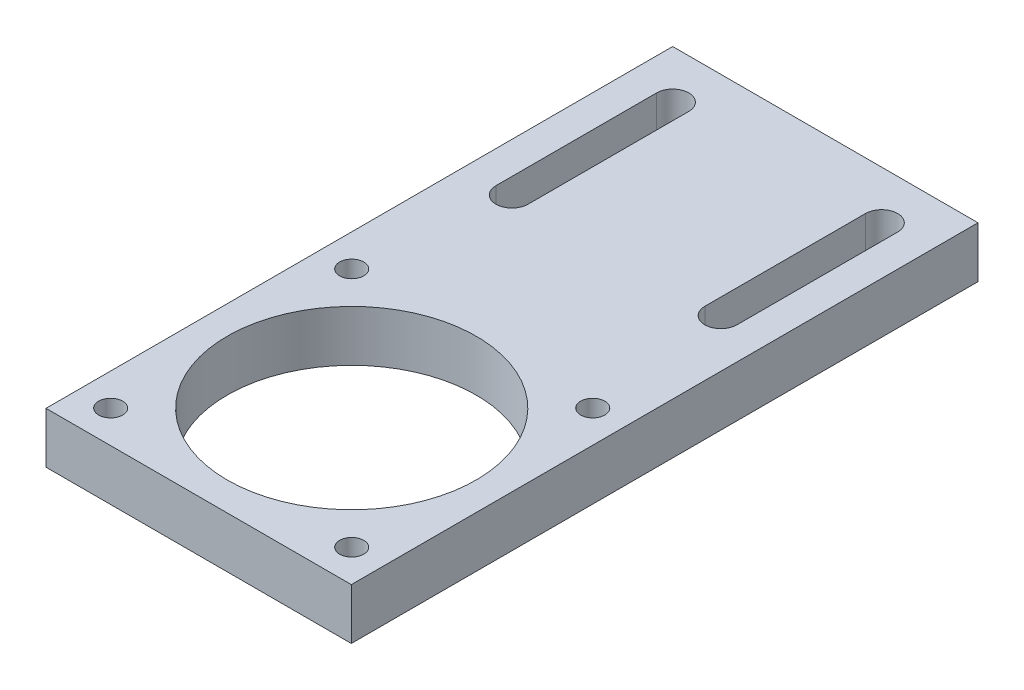
ISO-10303-21;
HEADER;
FILE_DESCRIPTION(('STEP AP214'),'2;1');
FILE_NAME('part.step','',(''),(''),'','','');
FILE_SCHEMA(('AUTOMOTIVE_DESIGN { 1 0 10303 214 1 1 1 1 }'));
ENDSEC;
DATA;
#1=APPLICATION_CONTEXT('core data for automotive mechanical design processes');
#2=APPLICATION_PROTOCOL_DEFINITION('international standard','automotive_design',2000,#1);
#3=PRODUCT_CONTEXT('',#1,'mechanical');
#4=PRODUCT('Part','Part','',(#3));
#5=PRODUCT_RELATED_PRODUCT_CATEGORY('part','',(#4));
#6=PRODUCT_DEFINITION_FORMATION('','',#4);
#7=PRODUCT_DEFINITION_CONTEXT('part definition',#1,'design');
#8=PRODUCT_DEFINITION('design','',#6,#7);
#9=PRODUCT_DEFINITION_SHAPE('','',#8);
#10=(LENGTH_UNIT() NAMED_UNIT(*) SI_UNIT(.MILLI.,.METRE.));
#11=(NAMED_UNIT(*) PLANE_ANGLE_UNIT() SI_UNIT($,.RADIAN.));
#12=(NAMED_UNIT(*) SI_UNIT($,.STERADIAN.) SOLID_ANGLE_UNIT());
#13=UNCERTAINTY_MEASURE_WITH_UNIT(LENGTH_MEASURE(1.E-05),#10,'distance_accuracy_value','');
#14=(GEOMETRIC_REPRESENTATION_CONTEXT(3) GLOBAL_UNCERTAINTY_ASSIGNED_CONTEXT((#13)) GLOBAL_UNIT_ASSIGNED_CONTEXT((#10,
#11,#12)) REPRESENTATION_CONTEXT('',''));
#15=CARTESIAN_POINT('',(0.,0.,0.));
#16=DIRECTION('',(0.,0.,1.));
#17=DIRECTION('',(1.,0.,0.));
#18=AXIS2_PLACEMENT_3D('',#15,#16,#17);
#19=CARTESIAN_POINT('',(0.,6.35,0.));
#20=DIRECTION('',(0.,-1.,0.));
#21=DIRECTION('',(0.,0.,-1.));
#22=AXIS2_PLACEMENT_3D('',#19,#20,#21);
#23=PLANE('',#22);
#24=CARTESIAN_POINT('',(19.,6.35,-19.05));
#25=DIRECTION('',(0.,1.,0.));
#26=DIRECTION('',(0.,0.,1.));
#27=AXIS2_PLACEMENT_3D('',#24,#25,#26);
#28=CIRCLE('',#27,15.5);
#29=CARTESIAN_POINT('',(19.,6.35,-3.54999999999999));
#30=VERTEX_POINT('',#29);
#31=EDGE_CURVE('E177',#30,#30,#28,.T.);
#32=ORIENTED_EDGE('',*,*,#31,.F.);
#33=EDGE_LOOP('',(#32));
#34=FACE_BOUND('',#33,.T.);
#35=CARTESIAN_POINT('',(3.99999999999999,6.35,-34.05));
#36=DIRECTION('',(0.,1.,0.));
#37=DIRECTION('',(0.,0.,1.));
#38=AXIS2_PLACEMENT_3D('',#35,#36,#37);
#39=CIRCLE('',#38,1.5);
#40=CARTESIAN_POINT('',(3.99999999999999,6.35,-32.55));
#41=VERTEX_POINT('',#40);
#42=EDGE_CURVE('E185',#41,#41,#39,.T.);
#43=ORIENTED_EDGE('',*,*,#42,.F.);
#44=EDGE_LOOP('',(#43));
#45=FACE_BOUND('',#44,.T.);
#46=CARTESIAN_POINT('',(34.,6.35,-34.05));
#47=DIRECTION('',(0.,1.,0.));
#48=DIRECTION('',(0.,0.,1.));
#49=AXIS2_PLACEMENT_3D('',#46,#47,#48);
#50=CIRCLE('',#49,1.5);
#51=CARTESIAN_POINT('',(34.,6.35,-32.55));
#52=VERTEX_POINT('',#51);
#53=EDGE_CURVE('E193',#52,#52,#50,.T.);
#54=ORIENTED_EDGE('',*,*,#53,.F.);
#55=EDGE_LOOP('',(#54));
#56=FACE_BOUND('',#55,.T.);
#57=CARTESIAN_POINT('',(34.,6.35,-4.04999999999999));
#58=DIRECTION('',(0.,1.,0.));
#59=DIRECTION('',(0.,0.,1.));
#60=AXIS2_PLACEMENT_3D('',#57,#58,#59);
#61=CIRCLE('',#60,1.5);
#62=CARTESIAN_POINT('',(34.,6.35,-2.54999999999999));
#63=VERTEX_POINT('',#62);
#64=EDGE_CURVE('E201',#63,#63,#61,.T.);
#65=ORIENTED_EDGE('',*,*,#64,.F.);
#66=EDGE_LOOP('',(#65));
#67=FACE_BOUND('',#66,.T.);
#68=CARTESIAN_POINT('',(4.,6.35,-4.04999999999999));
#69=DIRECTION('',(0.,1.,0.));
#70=DIRECTION('',(0.,0.,1.));
#71=AXIS2_PLACEMENT_3D('',#68,#69,#70);
#72=CIRCLE('',#71,1.5);
#73=CARTESIAN_POINT('',(4.,6.35,-2.54999999999999));
#74=VERTEX_POINT('',#73);
#75=EDGE_CURVE('E209',#74,#74,#72,.T.);
#76=ORIENTED_EDGE('',*,*,#75,.F.);
#77=EDGE_LOOP('',(#76));
#78=FACE_BOUND('',#77,.T.);
#79=CARTESIAN_POINT('',(6.,6.35,-72.));
#80=DIRECTION('',(0.,1.,0.));
#81=DIRECTION('',(0.,0.,1.));
#82=AXIS2_PLACEMENT_3D('',#79,#80,#81);
#83=CIRCLE('',#82,2.);
#84=CARTESIAN_POINT('',(8.,6.35,-72.));
#85=VERTEX_POINT('',#84);
#86=CARTESIAN_POINT('',(4.,6.35,-72.));
#87=VERTEX_POINT('',#86);
#88=EDGE_CURVE('E217',#85,#87,#83,.T.);
#89=ORIENTED_EDGE('',*,*,#88,.F.);
#90=DIRECTION('',(0.,0.,-1.));
#91=VECTOR('',#90,1.);
#92=CARTESIAN_POINT('',(8.,6.35,-72.));
#93=LINE('',#92,#91);
#94=CARTESIAN_POINT('',(8.,6.35,-52.));
#95=VERTEX_POINT('',#94);
#96=EDGE_CURVE('E228',#95,#85,#93,.T.);
#97=ORIENTED_EDGE('',*,*,#96,.F.);
#98=CARTESIAN_POINT('',(6.,6.35,-52.));
#99=DIRECTION('',(0.,1.,0.));
#100=DIRECTION('',(0.,0.,1.));
#101=AXIS2_PLACEMENT_3D('',#98,#99,#100);
#102=CIRCLE('',#101,2.);
#103=CARTESIAN_POINT('',(4.,6.35,-52.));
#104=VERTEX_POINT('',#103);
#105=EDGE_CURVE('E224',#104,#95,#102,.T.);
#106=ORIENTED_EDGE('',*,*,#105,.F.);
#107=DIRECTION('',(0.,0.,1.));
#108=VECTOR('',#107,1.);
#109=CARTESIAN_POINT('',(4.,6.35,-72.));
#110=LINE('',#109,#108);
#111=EDGE_CURVE('E220',#87,#104,#110,.T.);
#112=ORIENTED_EDGE('',*,*,#111,.F.);
#113=EDGE_LOOP('',(#89,#97,#106,#112));
#114=FACE_BOUND('',#113,.T.);
#115=DIRECTION('',(0.,0.,1.));
#116=VECTOR('',#115,1.);
#117=CARTESIAN_POINT('',(0.,6.35,0.));
#118=LINE('',#117,#116);
#119=CARTESIAN_POINT('',(0.,6.35,-78.));
#120=VERTEX_POINT('',#119);
#121=CARTESIAN_POINT('',(0.,6.35,0.));
#122=VERTEX_POINT('',#121);
#123=EDGE_CURVE('E260',#120,#122,#118,.T.);
#124=ORIENTED_EDGE('',*,*,#123,.T.);
#125=DIRECTION('',(1.,0.,0.));
#126=VECTOR('',#125,1.);
#127=CARTESIAN_POINT('',(0.,6.35,0.));
#128=LINE('',#127,#126);
#129=CARTESIAN_POINT('',(38.,6.35,0.));
#130=VERTEX_POINT('',#129);
#131=EDGE_CURVE('E264',#122,#130,#128,.T.);
#132=ORIENTED_EDGE('',*,*,#131,.T.);
#133=DIRECTION('',(0.,0.,-1.));
#134=VECTOR('',#133,1.);
#135=CARTESIAN_POINT('',(38.,6.35,0.));
#136=LINE('',#135,#134);
#137=CARTESIAN_POINT('',(38.,6.35,-78.));
#138=VERTEX_POINT('',#137);
#139=EDGE_CURVE('E268',#130,#138,#136,.T.);
#140=ORIENTED_EDGE('',*,*,#139,.T.);
#141=DIRECTION('',(-1.,0.,0.));
#142=VECTOR('',#141,1.);
#143=CARTESIAN_POINT('',(0.,6.35,-78.));
#144=LINE('',#143,#142);
#145=EDGE_CURVE('E271',#138,#120,#144,.T.);
#146=ORIENTED_EDGE('',*,*,#145,.T.);
#147=EDGE_LOOP('',(#124,#132,#140,#146));
#148=FACE_BOUND('',#147,.T.);
#149=CARTESIAN_POINT('',(32.,6.35,-72.));
#150=DIRECTION('',(0.,1.,0.));
#151=DIRECTION('',(0.,0.,-1.));
#152=AXIS2_PLACEMENT_3D('',#149,#150,#151);
#153=CIRCLE('',#152,2.);
#154=CARTESIAN_POINT('',(34.,6.35,-72.));
#155=VERTEX_POINT('',#154);
#156=CARTESIAN_POINT('',(30.,6.35,-72.));
#157=VERTEX_POINT('',#156);
#158=EDGE_CURVE('E129',#155,#157,#153,.T.);
#159=ORIENTED_EDGE('',*,*,#158,.F.);
#160=DIRECTION('',(0.,0.,-1.));
#161=VECTOR('',#160,1.);
#162=CARTESIAN_POINT('',(34.,6.35,-72.));
#163=LINE('',#162,#161);
#164=CARTESIAN_POINT('',(34.,6.35,-52.));
#165=VERTEX_POINT('',#164);
#166=EDGE_CURVE('E155',#165,#155,#163,.T.);
#167=ORIENTED_EDGE('',*,*,#166,.F.);
#168=CARTESIAN_POINT('',(32.,6.35,-52.));
#169=DIRECTION('',(0.,1.,0.));
#170=DIRECTION('',(0.,0.,-1.));
#171=AXIS2_PLACEMENT_3D('',#168,#169,#170);
#172=CIRCLE('',#171,2.);
#173=CARTESIAN_POINT('',(30.,6.35,-52.));
#174=VERTEX_POINT('',#173);
#175=EDGE_CURVE('E151',#174,#165,#172,.T.);
#176=ORIENTED_EDGE('',*,*,#175,.F.);
#177=DIRECTION('',(0.,0.,1.));
#178=VECTOR('',#177,1.);
#179=CARTESIAN_POINT('',(30.,6.35,-72.));
#180=LINE('',#179,#178);
#181=EDGE_CURVE('E138',#157,#174,#180,.T.);
#182=ORIENTED_EDGE('',*,*,#181,.F.);
#183=EDGE_LOOP('',(#159,#167,#176,#182));
#184=FACE_BOUND('',#183,.T.);
#185=ADVANCED_FACE('F39',(#34,#45,#56,#67,#78,#114,#148,#184),#23,.F.);
#186=CARTESIAN_POINT('',(0.,0.,0.));
#187=DIRECTION('',(0.,-1.,0.));
#188=DIRECTION('',(0.,0.,-1.));
#189=AXIS2_PLACEMENT_3D('',#186,#187,#188);
#190=PLANE('',#189);
#191=CARTESIAN_POINT('',(3.99999999999999,0.,-34.05));
#192=DIRECTION('',(0.,1.,0.));
#193=DIRECTION('',(0.,0.,1.));
#194=AXIS2_PLACEMENT_3D('',#191,#192,#193);
#195=CIRCLE('',#194,1.5);
#196=CARTESIAN_POINT('',(3.99999999999999,0.,-32.55));
#197=VERTEX_POINT('',#196);
#198=EDGE_CURVE('E181',#197,#197,#195,.T.);
#199=ORIENTED_EDGE('',*,*,#198,.T.);
#200=EDGE_LOOP('',(#199));
#201=FACE_BOUND('',#200,.T.);
#202=CARTESIAN_POINT('',(34.,0.,-4.04999999999999));
#203=DIRECTION('',(0.,1.,0.));
#204=DIRECTION('',(0.,0.,1.));
#205=AXIS2_PLACEMENT_3D('',#202,#203,#204);
#206=CIRCLE('',#205,1.5);
#207=CARTESIAN_POINT('',(34.,0.,-2.54999999999999));
#208=VERTEX_POINT('',#207);
#209=EDGE_CURVE('E197',#208,#208,#206,.T.);
#210=ORIENTED_EDGE('',*,*,#209,.T.);
#211=EDGE_LOOP('',(#210));
#212=FACE_BOUND('',#211,.T.);
#213=DIRECTION('',(0.,0.,-1.));
#214=VECTOR('',#213,1.);
#215=CARTESIAN_POINT('',(8.,0.,-72.));
#216=LINE('',#215,#214);
#217=CARTESIAN_POINT('',(8.,0.,-52.));
#218=VERTEX_POINT('',#217);
#219=CARTESIAN_POINT('',(8.,0.,-72.));
#220=VERTEX_POINT('',#219);
#221=EDGE_CURVE('E221',#218,#220,#216,.T.);
#222=ORIENTED_EDGE('',*,*,#221,.T.);
#223=CARTESIAN_POINT('',(6.,0.,-72.));
#224=DIRECTION('',(0.,1.,0.));
#225=DIRECTION('',(0.,0.,1.));
#226=AXIS2_PLACEMENT_3D('',#223,#224,#225);
#227=CIRCLE('',#226,2.);
#228=CARTESIAN_POINT('',(4.,0.,-72.));
#229=VERTEX_POINT('',#228);
#230=EDGE_CURVE('E213',#220,#229,#227,.T.);
#231=ORIENTED_EDGE('',*,*,#230,.T.);
#232=DIRECTION('',(0.,0.,1.));
#233=VECTOR('',#232,1.);
#234=CARTESIAN_POINT('',(4.,0.,-72.));
#235=LINE('',#234,#233);
#236=CARTESIAN_POINT('',(4.,0.,-52.));
#237=VERTEX_POINT('',#236);
#238=EDGE_CURVE('E235',#229,#237,#235,.T.);
#239=ORIENTED_EDGE('',*,*,#238,.T.);
#240=CARTESIAN_POINT('',(6.,0.,-52.));
#241=DIRECTION('',(0.,1.,0.));
#242=DIRECTION('',(0.,0.,1.));
#243=AXIS2_PLACEMENT_3D('',#240,#241,#242);
#244=CIRCLE('',#243,2.);
#245=EDGE_CURVE('E239',#237,#218,#244,.T.);
#246=ORIENTED_EDGE('',*,*,#245,.T.);
#247=EDGE_LOOP('',(#222,#231,#239,#246));
#248=FACE_BOUND('',#247,.T.);
#249=DIRECTION('',(0.,0.,1.));
#250=VECTOR('',#249,1.);
#251=CARTESIAN_POINT('',(0.,0.,0.));
#252=LINE('',#251,#250);
#253=CARTESIAN_POINT('',(0.,0.,-78.));
#254=VERTEX_POINT('',#253);
#255=CARTESIAN_POINT('',(0.,0.,0.));
#256=VERTEX_POINT('',#255);
#257=EDGE_CURVE('E259',#254,#256,#252,.T.);
#258=ORIENTED_EDGE('',*,*,#257,.F.);
#259=DIRECTION('',(-1.,0.,0.));
#260=VECTOR('',#259,1.);
#261=CARTESIAN_POINT('',(0.,0.,-78.));
#262=LINE('',#261,#260);
#263=CARTESIAN_POINT('',(38.,0.,-78.));
#264=VERTEX_POINT('',#263);
#265=EDGE_CURVE('E265',#264,#254,#262,.T.);
#266=ORIENTED_EDGE('',*,*,#265,.F.);
#267=DIRECTION('',(0.,0.,-1.));
#268=VECTOR('',#267,1.);
#269=CARTESIAN_POINT('',(38.,0.,0.));
#270=LINE('',#269,#268);
#271=CARTESIAN_POINT('',(38.,0.,0.));
#272=VERTEX_POINT('',#271);
#273=EDGE_CURVE('E281',#272,#264,#270,.T.);
#274=ORIENTED_EDGE('',*,*,#273,.F.);
#275=DIRECTION('',(1.,0.,0.));
#276=VECTOR('',#275,1.);
#277=CARTESIAN_POINT('',(0.,0.,0.));
#278=LINE('',#277,#276);
#279=EDGE_CURVE('E278',#256,#272,#278,.T.);
#280=ORIENTED_EDGE('',*,*,#279,.F.);
#281=EDGE_LOOP('',(#258,#266,#274,#280));
#282=FACE_BOUND('',#281,.T.);
#283=CARTESIAN_POINT('',(4.,0.,-4.04999999999999));
#284=DIRECTION('',(0.,1.,0.));
#285=DIRECTION('',(0.,0.,1.));
#286=AXIS2_PLACEMENT_3D('',#283,#284,#285);
#287=CIRCLE('',#286,1.5);
#288=CARTESIAN_POINT('',(4.,0.,-2.54999999999999));
#289=VERTEX_POINT('',#288);
#290=EDGE_CURVE('E205',#289,#289,#287,.T.);
#291=ORIENTED_EDGE('',*,*,#290,.T.);
#292=EDGE_LOOP('',(#291));
#293=FACE_BOUND('',#292,.T.);
#294=CARTESIAN_POINT('',(34.,0.,-34.05));
#295=DIRECTION('',(0.,1.,0.));
#296=DIRECTION('',(0.,0.,1.));
#297=AXIS2_PLACEMENT_3D('',#294,#295,#296);
#298=CIRCLE('',#297,1.5);
#299=CARTESIAN_POINT('',(34.,0.,-32.55));
#300=VERTEX_POINT('',#299);
#301=EDGE_CURVE('E189',#300,#300,#298,.T.);
#302=ORIENTED_EDGE('',*,*,#301,.T.);
#303=EDGE_LOOP('',(#302));
#304=FACE_BOUND('',#303,.T.);
#305=CARTESIAN_POINT('',(19.,0.,-19.05));
#306=DIRECTION('',(0.,1.,0.));
#307=DIRECTION('',(0.,0.,1.));
#308=AXIS2_PLACEMENT_3D('',#305,#306,#307);
#309=CIRCLE('',#308,15.5);
#310=CARTESIAN_POINT('',(19.,0.,-3.54999999999999));
#311=VERTEX_POINT('',#310);
#312=EDGE_CURVE('E147',#311,#311,#309,.T.);
#313=ORIENTED_EDGE('',*,*,#312,.T.);
#314=EDGE_LOOP('',(#313));
#315=FACE_BOUND('',#314,.T.);
#316=DIRECTION('',(0.,0.,-1.));
#317=VECTOR('',#316,1.);
#318=CARTESIAN_POINT('',(34.,0.,-72.));
#319=LINE('',#318,#317);
#320=CARTESIAN_POINT('',(34.,0.,-52.));
#321=VERTEX_POINT('',#320);
#322=CARTESIAN_POINT('',(34.,0.,-72.));
#323=VERTEX_POINT('',#322);
#324=EDGE_CURVE('E139',#321,#323,#319,.T.);
#325=ORIENTED_EDGE('',*,*,#324,.T.);
#326=CARTESIAN_POINT('',(32.,0.,-72.));
#327=DIRECTION('',(0.,1.,0.));
#328=DIRECTION('',(0.,0.,-1.));
#329=AXIS2_PLACEMENT_3D('',#326,#327,#328);
#330=CIRCLE('',#329,2.);
#331=CARTESIAN_POINT('',(30.,0.,-72.));
#332=VERTEX_POINT('',#331);
#333=EDGE_CURVE('E63',#323,#332,#330,.T.);
#334=ORIENTED_EDGE('',*,*,#333,.T.);
#335=DIRECTION('',(0.,0.,1.));
#336=VECTOR('',#335,1.);
#337=CARTESIAN_POINT('',(30.,0.,-72.));
#338=LINE('',#337,#336);
#339=CARTESIAN_POINT('',(30.,0.,-52.));
#340=VERTEX_POINT('',#339);
#341=EDGE_CURVE('E145',#332,#340,#338,.T.);
#342=ORIENTED_EDGE('',*,*,#341,.T.);
#343=CARTESIAN_POINT('',(32.,0.,-52.));
#344=DIRECTION('',(0.,1.,0.));
#345=DIRECTION('',(0.,0.,-1.));
#346=AXIS2_PLACEMENT_3D('',#343,#344,#345);
#347=CIRCLE('',#346,2.);
#348=EDGE_CURVE('E164',#340,#321,#347,.T.);
#349=ORIENTED_EDGE('',*,*,#348,.T.);
#350=EDGE_LOOP('',(#325,#334,#342,#349));
#351=FACE_BOUND('',#350,.T.);
#352=ADVANCED_FACE('F304',(#201,#212,#248,#282,#293,#304,#315,#351),#190,.T.);
#353=CARTESIAN_POINT('',(0.,6.35,0.));
#354=DIRECTION('',(1.,0.,0.));
#355=DIRECTION('',(0.,0.,-1.));
#356=AXIS2_PLACEMENT_3D('',#353,#354,#355);
#357=PLANE('',#356);
#358=ORIENTED_EDGE('',*,*,#257,.T.);
#359=DIRECTION('',(0.,-1.,0.));
#360=VECTOR('',#359,1.);
#361=CARTESIAN_POINT('',(0.,6.35,0.));
#362=LINE('',#361,#360);
#363=EDGE_CURVE('E11',#122,#256,#362,.T.);
#364=ORIENTED_EDGE('',*,*,#363,.F.);
#365=ORIENTED_EDGE('',*,*,#123,.F.);
#366=DIRECTION('',(0.,-1.,0.));
#367=VECTOR('',#366,1.);
#368=CARTESIAN_POINT('',(0.,6.35,-78.));
#369=LINE('',#368,#367);
#370=EDGE_CURVE('E274',#120,#254,#369,.T.);
#371=ORIENTED_EDGE('',*,*,#370,.T.);
#372=EDGE_LOOP('',(#358,#364,#365,#371));
#373=FACE_BOUND('',#372,.T.);
#374=ADVANCED_FACE('F41',(#373),#357,.F.);
#375=CARTESIAN_POINT('',(0.,6.35,0.));
#376=DIRECTION('',(0.,0.,-1.));
#377=DIRECTION('',(-1.,0.,0.));
#378=AXIS2_PLACEMENT_3D('',#375,#376,#377);
#379=PLANE('',#378);
#380=ORIENTED_EDGE('',*,*,#279,.T.);
#381=DIRECTION('',(0.,-1.,0.));
#382=VECTOR('',#381,1.);
#383=CARTESIAN_POINT('',(38.,6.35,0.));
#384=LINE('',#383,#382);
#385=EDGE_CURVE('E48',#130,#272,#384,.T.);
#386=ORIENTED_EDGE('',*,*,#385,.F.);
#387=ORIENTED_EDGE('',*,*,#131,.F.);
#388=ORIENTED_EDGE('',*,*,#363,.T.);
#389=EDGE_LOOP('',(#380,#386,#387,#388));
#390=FACE_BOUND('',#389,.T.);
#391=ADVANCED_FACE('F314',(#390),#379,.F.);
#392=CARTESIAN_POINT('',(38.,6.35,0.));
#393=DIRECTION('',(-1.,0.,0.));
#394=DIRECTION('',(0.,0.,1.));
#395=AXIS2_PLACEMENT_3D('',#392,#393,#394);
#396=PLANE('',#395);
#397=ORIENTED_EDGE('',*,*,#273,.T.);
#398=DIRECTION('',(0.,-1.,0.));
#399=VECTOR('',#398,1.);
#400=CARTESIAN_POINT('',(38.,6.35,-78.));
#401=LINE('',#400,#399);
#402=EDGE_CURVE('E289',#138,#264,#401,.T.);
#403=ORIENTED_EDGE('',*,*,#402,.F.);
#404=ORIENTED_EDGE('',*,*,#139,.F.);
#405=ORIENTED_EDGE('',*,*,#385,.T.);
#406=EDGE_LOOP('',(#397,#403,#404,#405));
#407=FACE_BOUND('',#406,.T.);
#408=ADVANCED_FACE('F298',(#407),#396,.F.);
#409=CARTESIAN_POINT('',(0.,6.35,-78.));
#410=DIRECTION('',(0.,0.,1.));
#411=DIRECTION('',(1.,0.,0.));
#412=AXIS2_PLACEMENT_3D('',#409,#410,#411);
#413=PLANE('',#412);
#414=ORIENTED_EDGE('',*,*,#265,.T.);
#415=ORIENTED_EDGE('',*,*,#370,.F.);
#416=ORIENTED_EDGE('',*,*,#145,.F.);
#417=ORIENTED_EDGE('',*,*,#402,.T.);
#418=EDGE_LOOP('',(#414,#415,#416,#417));
#419=FACE_BOUND('',#418,.T.);
#420=ADVANCED_FACE('F308',(#419),#413,.F.);
#421=CARTESIAN_POINT('',(6.,6.35,-72.));
#422=DIRECTION('',(0.,-1.,0.));
#423=DIRECTION('',(0.,0.,-1.));
#424=AXIS2_PLACEMENT_3D('',#421,#422,#423);
#425=CYLINDRICAL_SURFACE('',#424,2.);
#426=ORIENTED_EDGE('',*,*,#230,.F.);
#427=DIRECTION('',(0.,-1.,0.));
#428=VECTOR('',#427,1.);
#429=CARTESIAN_POINT('',(8.,6.35,-72.));
#430=LINE('',#429,#428);
#431=EDGE_CURVE('E231',#85,#220,#430,.T.);
#432=ORIENTED_EDGE('',*,*,#431,.F.);
#433=ORIENTED_EDGE('',*,*,#88,.T.);
#434=DIRECTION('',(0.,-1.,0.));
#435=VECTOR('',#434,1.);
#436=CARTESIAN_POINT('',(4.,6.35,-72.));
#437=LINE('',#436,#435);
#438=EDGE_CURVE('E255',#87,#229,#437,.T.);
#439=ORIENTED_EDGE('',*,*,#438,.T.);
#440=EDGE_LOOP('',(#426,#432,#433,#439));
#441=FACE_BOUND('',#440,.T.);
#442=ADVANCED_FACE('F332',(#441),#425,.F.);
#443=CARTESIAN_POINT('',(4.,6.35,-72.));
#444=DIRECTION('',(1.,0.,0.));
#445=DIRECTION('',(0.,0.,-1.));
#446=AXIS2_PLACEMENT_3D('',#443,#444,#445);
#447=PLANE('',#446);
#448=ORIENTED_EDGE('',*,*,#238,.F.);
#449=ORIENTED_EDGE('',*,*,#438,.F.);
#450=ORIENTED_EDGE('',*,*,#111,.T.);
#451=DIRECTION('',(0.,-1.,0.));
#452=VECTOR('',#451,1.);
#453=CARTESIAN_POINT('',(4.,6.35,-52.));
#454=LINE('',#453,#452);
#455=EDGE_CURVE('E252',#104,#237,#454,.T.);
#456=ORIENTED_EDGE('',*,*,#455,.T.);
#457=EDGE_LOOP('',(#448,#449,#450,#456));
#458=FACE_BOUND('',#457,.T.);
#459=ADVANCED_FACE('F339',(#458),#447,.T.);
#460=CARTESIAN_POINT('',(6.,6.35,-52.));
#461=DIRECTION('',(0.,-1.,0.));
#462=DIRECTION('',(0.,0.,-1.));
#463=AXIS2_PLACEMENT_3D('',#460,#461,#462);
#464=CYLINDRICAL_SURFACE('',#463,2.);
#465=ORIENTED_EDGE('',*,*,#245,.F.);
#466=ORIENTED_EDGE('',*,*,#455,.F.);
#467=ORIENTED_EDGE('',*,*,#105,.T.);
#468=DIRECTION('',(0.,-1.,0.));
#469=VECTOR('',#468,1.);
#470=CARTESIAN_POINT('',(8.,6.35,-52.));
#471=LINE('',#470,#469);
#472=EDGE_CURVE('E249',#95,#218,#471,.T.);
#473=ORIENTED_EDGE('',*,*,#472,.T.);
#474=EDGE_LOOP('',(#465,#466,#467,#473));
#475=FACE_BOUND('',#474,.T.);
#476=ADVANCED_FACE('F344',(#475),#464,.F.);
#477=CARTESIAN_POINT('',(8.,6.35,-72.));
#478=DIRECTION('',(-1.,0.,0.));
#479=DIRECTION('',(0.,0.,1.));
#480=AXIS2_PLACEMENT_3D('',#477,#478,#479);
#481=PLANE('',#480);
#482=ORIENTED_EDGE('',*,*,#221,.F.);
#483=ORIENTED_EDGE('',*,*,#472,.F.);
#484=ORIENTED_EDGE('',*,*,#96,.T.);
#485=ORIENTED_EDGE('',*,*,#431,.T.);
#486=EDGE_LOOP('',(#482,#483,#484,#485));
#487=FACE_BOUND('',#486,.T.);
#488=ADVANCED_FACE('F352',(#487),#481,.T.);
#489=CARTESIAN_POINT('',(4.,6.35,-4.04999999999999));
#490=DIRECTION('',(0.,-1.,0.));
#491=DIRECTION('',(0.,0.,-1.));
#492=AXIS2_PLACEMENT_3D('',#489,#490,#491);
#493=CYLINDRICAL_SURFACE('',#492,1.5);
#494=ORIENTED_EDGE('',*,*,#75,.T.);
#495=EDGE_LOOP('',(#494));
#496=FACE_BOUND('',#495,.T.);
#497=ORIENTED_EDGE('',*,*,#290,.F.);
#498=EDGE_LOOP('',(#497));
#499=FACE_BOUND('',#498,.T.);
#500=ADVANCED_FACE('F365',(#496,#499),#493,.F.);
#501=CARTESIAN_POINT('',(34.,6.35,-4.04999999999999));
#502=DIRECTION('',(0.,-1.,0.));
#503=DIRECTION('',(0.,0.,-1.));
#504=AXIS2_PLACEMENT_3D('',#501,#502,#503);
#505=CYLINDRICAL_SURFACE('',#504,1.5);
#506=ORIENTED_EDGE('',*,*,#64,.T.);
#507=EDGE_LOOP('',(#506));
#508=FACE_BOUND('',#507,.T.);
#509=ORIENTED_EDGE('',*,*,#209,.F.);
#510=EDGE_LOOP('',(#509));
#511=FACE_BOUND('',#510,.T.);
#512=ADVANCED_FACE('F370',(#508,#511),#505,.F.);
#513=CARTESIAN_POINT('',(34.,6.35,-34.05));
#514=DIRECTION('',(0.,-1.,0.));
#515=DIRECTION('',(0.,0.,-1.));
#516=AXIS2_PLACEMENT_3D('',#513,#514,#515);
#517=CYLINDRICAL_SURFACE('',#516,1.5);
#518=ORIENTED_EDGE('',*,*,#53,.T.);
#519=EDGE_LOOP('',(#518));
#520=FACE_BOUND('',#519,.T.);
#521=ORIENTED_EDGE('',*,*,#301,.F.);
#522=EDGE_LOOP('',(#521));
#523=FACE_BOUND('',#522,.T.);
#524=ADVANCED_FACE('F374',(#520,#523),#517,.F.);
#525=CARTESIAN_POINT('',(3.99999999999999,6.35,-34.05));
#526=DIRECTION('',(0.,-1.,0.));
#527=DIRECTION('',(0.,0.,-1.));
#528=AXIS2_PLACEMENT_3D('',#525,#526,#527);
#529=CYLINDRICAL_SURFACE('',#528,1.5);
#530=ORIENTED_EDGE('',*,*,#42,.T.);
#531=EDGE_LOOP('',(#530));
#532=FACE_BOUND('',#531,.T.);
#533=ORIENTED_EDGE('',*,*,#198,.F.);
#534=EDGE_LOOP('',(#533));
#535=FACE_BOUND('',#534,.T.);
#536=ADVANCED_FACE('F378',(#532,#535),#529,.F.);
#537=CARTESIAN_POINT('',(19.,6.35,-19.05));
#538=DIRECTION('',(0.,-1.,0.));
#539=DIRECTION('',(0.,0.,-1.));
#540=AXIS2_PLACEMENT_3D('',#537,#538,#539);
#541=CYLINDRICAL_SURFACE('',#540,15.5);
#542=ORIENTED_EDGE('',*,*,#31,.T.);
#543=EDGE_LOOP('',(#542));
#544=FACE_BOUND('',#543,.T.);
#545=ORIENTED_EDGE('',*,*,#312,.F.);
#546=EDGE_LOOP('',(#545));
#547=FACE_BOUND('',#546,.T.);
#548=ADVANCED_FACE('F382',(#544,#547),#541,.F.);
#549=CARTESIAN_POINT('',(32.,6.35,-72.));
#550=DIRECTION('',(0.,-1.,0.));
#551=DIRECTION('',(0.,0.,-1.));
#552=AXIS2_PLACEMENT_3D('',#549,#550,#551);
#553=CYLINDRICAL_SURFACE('',#552,2.);
#554=ORIENTED_EDGE('',*,*,#333,.F.);
#555=DIRECTION('',(0.,-1.,0.));
#556=VECTOR('',#555,1.);
#557=CARTESIAN_POINT('',(34.,6.35,-72.));
#558=LINE('',#557,#556);
#559=EDGE_CURVE('E133',#155,#323,#558,.T.);
#560=ORIENTED_EDGE('',*,*,#559,.F.);
#561=ORIENTED_EDGE('',*,*,#158,.T.);
#562=DIRECTION('',(0.,-1.,0.));
#563=VECTOR('',#562,1.);
#564=CARTESIAN_POINT('',(30.,6.35,-72.));
#565=LINE('',#564,#563);
#566=EDGE_CURVE('E132',#157,#332,#565,.T.);
#567=ORIENTED_EDGE('',*,*,#566,.T.);
#568=EDGE_LOOP('',(#554,#560,#561,#567));
#569=FACE_BOUND('',#568,.T.);
#570=ADVANCED_FACE('F131',(#569),#553,.F.);
#571=CARTESIAN_POINT('',(30.,6.35,-72.));
#572=DIRECTION('',(1.,0.,0.));
#573=DIRECTION('',(0.,0.,-1.));
#574=AXIS2_PLACEMENT_3D('',#571,#572,#573);
#575=PLANE('',#574);
#576=ORIENTED_EDGE('',*,*,#341,.F.);
#577=ORIENTED_EDGE('',*,*,#566,.F.);
#578=ORIENTED_EDGE('',*,*,#181,.T.);
#579=DIRECTION('',(0.,-1.,0.));
#580=VECTOR('',#579,1.);
#581=CARTESIAN_POINT('',(30.,6.35,-52.));
#582=LINE('',#581,#580);
#583=EDGE_CURVE('E148',#174,#340,#582,.T.);
#584=ORIENTED_EDGE('',*,*,#583,.T.);
#585=EDGE_LOOP('',(#576,#577,#578,#584));
#586=FACE_BOUND('',#585,.T.);
#587=ADVANCED_FACE('F142',(#586),#575,.T.);
#588=CARTESIAN_POINT('',(32.,6.35,-52.));
#589=DIRECTION('',(0.,-1.,0.));
#590=DIRECTION('',(0.,0.,-1.));
#591=AXIS2_PLACEMENT_3D('',#588,#589,#590);
#592=CYLINDRICAL_SURFACE('',#591,2.);
#593=ORIENTED_EDGE('',*,*,#348,.F.);
#594=ORIENTED_EDGE('',*,*,#583,.F.);
#595=ORIENTED_EDGE('',*,*,#175,.T.);
#596=DIRECTION('',(0.,-1.,0.));
#597=VECTOR('',#596,1.);
#598=CARTESIAN_POINT('',(34.,6.35,-52.));
#599=LINE('',#598,#597);
#600=EDGE_CURVE('E55',#165,#321,#599,.T.);
#601=ORIENTED_EDGE('',*,*,#600,.T.);
#602=EDGE_LOOP('',(#593,#594,#595,#601));
#603=FACE_BOUND('',#602,.T.);
#604=ADVANCED_FACE('F391',(#603),#592,.F.);
#605=CARTESIAN_POINT('',(34.,6.35,-72.));
#606=DIRECTION('',(-1.,0.,0.));
#607=DIRECTION('',(0.,0.,1.));
#608=AXIS2_PLACEMENT_3D('',#605,#606,#607);
#609=PLANE('',#608);
#610=ORIENTED_EDGE('',*,*,#324,.F.);
#611=ORIENTED_EDGE('',*,*,#600,.F.);
#612=ORIENTED_EDGE('',*,*,#166,.T.);
#613=ORIENTED_EDGE('',*,*,#559,.T.);
#614=EDGE_LOOP('',(#610,#611,#612,#613));
#615=FACE_BOUND('',#614,.T.);
#616=ADVANCED_FACE('F394',(#615),#609,.T.);
#617=CLOSED_SHELL('',(#185,#352,#374,#391,#408,#420,#442,#459,#476,#488,#500,#512,#524,#536,
#548,#570,#587,#604,#616));
#618=MANIFOLD_SOLID_BREP('B2',#617);
#619=ADVANCED_BREP_SHAPE_REPRESENTATION('',(#18,#618),#14);
#620=SHAPE_DEFINITION_REPRESENTATION(#9,#619);
ENDSEC;
END-ISO-10303-21;
